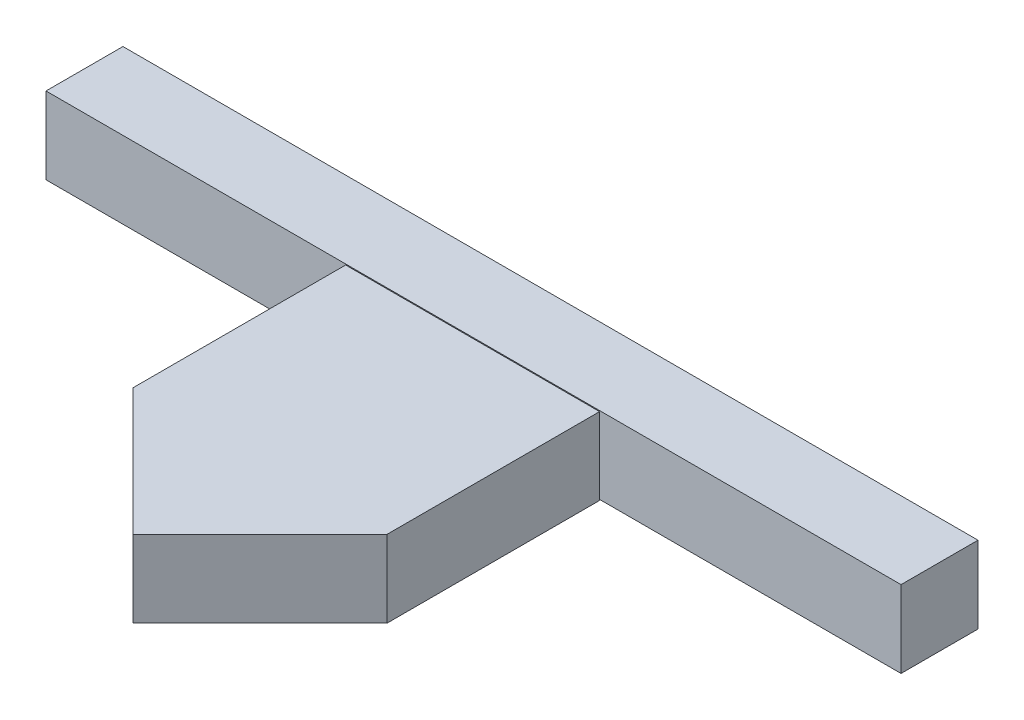
ISO-10303-21;
HEADER;
FILE_DESCRIPTION(('STEP AP214'),'2;1');
FILE_NAME('part.step','',(''),(''),'','','');
FILE_SCHEMA(('AUTOMOTIVE_DESIGN { 1 0 10303 214 1 1 1 1 }'));
ENDSEC;
DATA;
#1=APPLICATION_CONTEXT('core data for automotive mechanical design processes');
#2=APPLICATION_PROTOCOL_DEFINITION('international standard','automotive_design',2000,#1);
#3=PRODUCT_CONTEXT('',#1,'mechanical');
#4=PRODUCT('Part','Part','',(#3));
#5=PRODUCT_RELATED_PRODUCT_CATEGORY('part','',(#4));
#6=PRODUCT_DEFINITION_FORMATION('','',#4);
#7=PRODUCT_DEFINITION_CONTEXT('part definition',#1,'design');
#8=PRODUCT_DEFINITION('design','',#6,#7);
#9=PRODUCT_DEFINITION_SHAPE('','',#8);
#10=(LENGTH_UNIT() NAMED_UNIT(*) SI_UNIT(.MILLI.,.METRE.));
#11=(NAMED_UNIT(*) PLANE_ANGLE_UNIT() SI_UNIT($,.RADIAN.));
#12=(NAMED_UNIT(*) SI_UNIT($,.STERADIAN.) SOLID_ANGLE_UNIT());
#13=UNCERTAINTY_MEASURE_WITH_UNIT(LENGTH_MEASURE(1.E-05),#10,'distance_accuracy_value','');
#14=(GEOMETRIC_REPRESENTATION_CONTEXT(3) GLOBAL_UNCERTAINTY_ASSIGNED_CONTEXT((#13)) GLOBAL_UNIT_ASSIGNED_CONTEXT((#10,
#11,#12)) REPRESENTATION_CONTEXT('',''));
#15=CARTESIAN_POINT('',(0.,0.,0.));
#16=DIRECTION('',(0.,0.,1.));
#17=DIRECTION('',(1.,0.,0.));
#18=AXIS2_PLACEMENT_3D('',#15,#16,#17);
#19=CARTESIAN_POINT('',(50.0000000000002,9.,0.));
#20=DIRECTION('',(1.,0.,0.));
#21=DIRECTION('',(0.,0.,-1.));
#22=AXIS2_PLACEMENT_3D('',#19,#20,#21);
#23=PLANE('',#22);
#24=DIRECTION('',(0.,0.,1.));
#25=VECTOR('',#24,1.);
#26=CARTESIAN_POINT('',(50.0000000000002,0.,0.));
#27=LINE('',#26,#25);
#28=CARTESIAN_POINT('',(50.0000000000002,0.,-33.9572754688822));
#29=VERTEX_POINT('',#28);
#30=CARTESIAN_POINT('',(50.0000000000002,0.,-24.9572754688822));
#31=VERTEX_POINT('',#30);
#32=EDGE_CURVE('E118',#29,#31,#27,.T.);
#33=ORIENTED_EDGE('',*,*,#32,.F.);
#34=DIRECTION('',(0.,-1.,0.));
#35=VECTOR('',#34,1.);
#36=CARTESIAN_POINT('',(50.0000000000002,9.,-33.9572754688822));
#37=LINE('',#36,#35);
#38=CARTESIAN_POINT('',(50.0000000000002,9.,-33.9572754688822));
#39=VERTEX_POINT('',#38);
#40=EDGE_CURVE('E12',#39,#29,#37,.T.);
#41=ORIENTED_EDGE('',*,*,#40,.F.);
#42=DIRECTION('',(0.,0.,1.));
#43=VECTOR('',#42,1.);
#44=CARTESIAN_POINT('',(50.0000000000002,9.,0.));
#45=LINE('',#44,#43);
#46=CARTESIAN_POINT('',(50.0000000000002,9.,-24.9572754688822));
#47=VERTEX_POINT('',#46);
#48=EDGE_CURVE('E108',#39,#47,#45,.T.);
#49=ORIENTED_EDGE('',*,*,#48,.T.);
#50=DIRECTION('',(0.,-1.,0.));
#51=VECTOR('',#50,1.);
#52=CARTESIAN_POINT('',(50.0000000000002,9.,-24.9572754688822));
#53=LINE('',#52,#51);
#54=EDGE_CURVE('E87',#47,#31,#53,.T.);
#55=ORIENTED_EDGE('',*,*,#54,.T.);
#56=EDGE_LOOP('',(#33,#41,#49,#55));
#57=FACE_BOUND('',#56,.T.);
#58=ADVANCED_FACE('F48',(#57),#23,.T.);
#59=CARTESIAN_POINT('',(0.,9.,-33.9572754688822));
#60=DIRECTION('',(0.,0.,-1.));
#61=DIRECTION('',(-1.,0.,0.));
#62=AXIS2_PLACEMENT_3D('',#59,#60,#61);
#63=PLANE('',#62);
#64=DIRECTION('',(1.,0.,0.));
#65=VECTOR('',#64,1.);
#66=CARTESIAN_POINT('',(0.,0.,-33.9572754688822));
#67=LINE('',#66,#65);
#68=CARTESIAN_POINT('',(-49.9999999999998,0.,-33.9572754688822));
#69=VERTEX_POINT('',#68);
#70=EDGE_CURVE('E100',#69,#29,#67,.T.);
#71=ORIENTED_EDGE('',*,*,#70,.F.);
#72=DIRECTION('',(0.,-1.,0.));
#73=VECTOR('',#72,1.);
#74=CARTESIAN_POINT('',(-49.9999999999998,9.,-33.9572754688822));
#75=LINE('',#74,#73);
#76=CARTESIAN_POINT('',(-49.9999999999998,9.,-33.9572754688822));
#77=VERTEX_POINT('',#76);
#78=EDGE_CURVE('E57',#77,#69,#75,.T.);
#79=ORIENTED_EDGE('',*,*,#78,.F.);
#80=DIRECTION('',(1.,0.,0.));
#81=VECTOR('',#80,1.);
#82=CARTESIAN_POINT('',(0.,9.,-33.9572754688822));
#83=LINE('',#82,#81);
#84=EDGE_CURVE('E98',#77,#39,#83,.T.);
#85=ORIENTED_EDGE('',*,*,#84,.T.);
#86=ORIENTED_EDGE('',*,*,#40,.T.);
#87=EDGE_LOOP('',(#71,#79,#85,#86));
#88=FACE_BOUND('',#87,.T.);
#89=ADVANCED_FACE('F96',(#88),#63,.T.);
#90=CARTESIAN_POINT('',(-49.9999999999998,9.,0.));
#91=DIRECTION('',(1.,0.,0.));
#92=DIRECTION('',(0.,0.,-1.));
#93=AXIS2_PLACEMENT_3D('',#90,#91,#92);
#94=PLANE('',#93);
#95=DIRECTION('',(0.,0.,1.));
#96=VECTOR('',#95,1.);
#97=CARTESIAN_POINT('',(-49.9999999999998,0.,0.));
#98=LINE('',#97,#96);
#99=CARTESIAN_POINT('',(-49.9999999999998,0.,-24.9572754688822));
#100=VERTEX_POINT('',#99);
#101=EDGE_CURVE('E80',#69,#100,#98,.T.);
#102=ORIENTED_EDGE('',*,*,#101,.T.);
#103=DIRECTION('',(0.,-1.,0.));
#104=VECTOR('',#103,1.);
#105=CARTESIAN_POINT('',(-49.9999999999998,9.,-24.9572754688822));
#106=LINE('',#105,#104);
#107=CARTESIAN_POINT('',(-49.9999999999998,9.,-24.9572754688822));
#108=VERTEX_POINT('',#107);
#109=EDGE_CURVE('E102',#108,#100,#106,.T.);
#110=ORIENTED_EDGE('',*,*,#109,.F.);
#111=DIRECTION('',(0.,0.,1.));
#112=VECTOR('',#111,1.);
#113=CARTESIAN_POINT('',(-49.9999999999998,9.,0.));
#114=LINE('',#113,#112);
#115=EDGE_CURVE('E103',#77,#108,#114,.T.);
#116=ORIENTED_EDGE('',*,*,#115,.F.);
#117=ORIENTED_EDGE('',*,*,#78,.T.);
#118=EDGE_LOOP('',(#102,#110,#116,#117));
#119=FACE_BOUND('',#118,.T.);
#120=ADVANCED_FACE('F104',(#119),#94,.F.);
#121=CARTESIAN_POINT('',(0.,9.,-24.9572754688822));
#122=DIRECTION('',(0.,0.,-1.));
#123=DIRECTION('',(-1.,0.,0.));
#124=AXIS2_PLACEMENT_3D('',#121,#122,#123);
#125=PLANE('',#124);
#126=DIRECTION('',(1.,0.,0.));
#127=VECTOR('',#126,1.);
#128=CARTESIAN_POINT('',(0.,0.,-24.9572754688822));
#129=LINE('',#128,#127);
#130=EDGE_CURVE('E113',#100,#31,#129,.T.);
#131=ORIENTED_EDGE('',*,*,#130,.T.);
#132=ORIENTED_EDGE('',*,*,#54,.F.);
#133=DIRECTION('',(1.,0.,0.));
#134=VECTOR('',#133,1.);
#135=CARTESIAN_POINT('',(0.,9.,-24.9572754688822));
#136=LINE('',#135,#134);
#137=EDGE_CURVE('E65',#108,#47,#136,.T.);
#138=ORIENTED_EDGE('',*,*,#137,.F.);
#139=ORIENTED_EDGE('',*,*,#109,.T.);
#140=EDGE_LOOP('',(#131,#132,#138,#139));
#141=FACE_BOUND('',#140,.T.);
#142=ADVANCED_FACE('F132',(#141),#125,.F.);
#143=CARTESIAN_POINT('',(0.,9.,0.));
#144=DIRECTION('',(0.,1.,0.));
#145=DIRECTION('',(0.,0.,1.));
#146=AXIS2_PLACEMENT_3D('',#143,#144,#145);
#147=PLANE('',#146);
#148=ORIENTED_EDGE('',*,*,#48,.F.);
#149=ORIENTED_EDGE('',*,*,#84,.F.);
#150=ORIENTED_EDGE('',*,*,#115,.T.);
#151=ORIENTED_EDGE('',*,*,#137,.T.);
#152=EDGE_LOOP('',(#148,#149,#150,#151));
#153=FACE_BOUND('',#152,.T.);
#154=ADVANCED_FACE('F107',(#153),#147,.T.);
#155=CARTESIAN_POINT('',(0.,0.,0.));
#156=DIRECTION('',(0.,1.,0.));
#157=DIRECTION('',(0.,0.,1.));
#158=AXIS2_PLACEMENT_3D('',#155,#156,#157);
#159=PLANE('',#158);
#160=ORIENTED_EDGE('',*,*,#32,.T.);
#161=ORIENTED_EDGE('',*,*,#130,.F.);
#162=ORIENTED_EDGE('',*,*,#101,.F.);
#163=ORIENTED_EDGE('',*,*,#70,.T.);
#164=EDGE_LOOP('',(#160,#161,#162,#163));
#165=FACE_BOUND('',#164,.T.);
#166=ADVANCED_FACE('F134',(#165),#159,.F.);
#167=CLOSED_SHELL('',(#58,#89,#120,#142,#154,#166));
#168=MANIFOLD_SOLID_BREP('B2',#167);
#169=CARTESIAN_POINT('',(7.42462120245875,9.,7.42462120245875));
#170=DIRECTION('',(-0.707106781186547,0.,-0.707106781186547));
#171=DIRECTION('',(-0.707106781186548,0.,0.707106781186548));
#172=AXIS2_PLACEMENT_3D('',#169,#170,#171);
#173=PLANE('',#172);
#174=DIRECTION('',(0.707106781186548,0.,-0.707106781186548));
#175=VECTOR('',#174,1.);
#176=CARTESIAN_POINT('',(7.42462120245875,0.,7.42462120245875));
#177=LINE('',#176,#175);
#178=CARTESIAN_POINT('',(0.,0.,14.8492424049175));
#179=VERTEX_POINT('',#178);
#180=CARTESIAN_POINT('',(14.8492424049175,0.,0.));
#181=VERTEX_POINT('',#180);
#182=EDGE_CURVE('E275',#179,#181,#177,.T.);
#183=ORIENTED_EDGE('',*,*,#182,.T.);
#184=DIRECTION('',(0.,-1.,0.));
#185=VECTOR('',#184,1.);
#186=CARTESIAN_POINT('',(14.8492424049175,9.,0.));
#187=LINE('',#186,#185);
#188=CARTESIAN_POINT('',(14.8492424049175,9.,0.));
#189=VERTEX_POINT('',#188);
#190=EDGE_CURVE('E46',#189,#181,#187,.T.);
#191=ORIENTED_EDGE('',*,*,#190,.F.);
#192=DIRECTION('',(0.707106781186548,0.,-0.707106781186548));
#193=VECTOR('',#192,1.);
#194=CARTESIAN_POINT('',(7.42462120245875,9.,7.42462120245875));
#195=LINE('',#194,#193);
#196=CARTESIAN_POINT('',(0.,9.,14.8492424049175));
#197=VERTEX_POINT('',#196);
#198=EDGE_CURVE('E240',#197,#189,#195,.T.);
#199=ORIENTED_EDGE('',*,*,#198,.F.);
#200=DIRECTION('',(0.,-1.,0.));
#201=VECTOR('',#200,1.);
#202=CARTESIAN_POINT('',(0.,9.,14.8492424049175));
#203=LINE('',#202,#201);
#204=EDGE_CURVE('E212',#197,#179,#203,.T.);
#205=ORIENTED_EDGE('',*,*,#204,.T.);
#206=EDGE_LOOP('',(#183,#191,#199,#205));
#207=FACE_BOUND('',#206,.T.);
#208=ADVANCED_FACE('F195',(#207),#173,.F.);
#209=CARTESIAN_POINT('',(14.8492424049175,9.,0.));
#210=DIRECTION('',(1.,0.,0.));
#211=DIRECTION('',(0.,0.,-1.));
#212=AXIS2_PLACEMENT_3D('',#209,#210,#211);
#213=PLANE('',#212);
#214=DIRECTION('',(0.,0.,1.));
#215=VECTOR('',#214,1.);
#216=CARTESIAN_POINT('',(14.8492424049175,0.,0.));
#217=LINE('',#216,#215);
#218=CARTESIAN_POINT('',(14.8492424049175,0.,-24.8492424049175));
#219=VERTEX_POINT('',#218);
#220=EDGE_CURVE('E278',#219,#181,#217,.T.);
#221=ORIENTED_EDGE('',*,*,#220,.F.);
#222=DIRECTION('',(0.,-1.,0.));
#223=VECTOR('',#222,1.);
#224=CARTESIAN_POINT('',(14.8492424049175,9.,-24.8492424049175));
#225=LINE('',#224,#223);
#226=CARTESIAN_POINT('',(14.8492424049175,9.,-24.8492424049175));
#227=VERTEX_POINT('',#226);
#228=EDGE_CURVE('E204',#227,#219,#225,.T.);
#229=ORIENTED_EDGE('',*,*,#228,.F.);
#230=DIRECTION('',(0.,0.,1.));
#231=VECTOR('',#230,1.);
#232=CARTESIAN_POINT('',(14.8492424049175,9.,0.));
#233=LINE('',#232,#231);
#234=EDGE_CURVE('E263',#227,#189,#233,.T.);
#235=ORIENTED_EDGE('',*,*,#234,.T.);
#236=ORIENTED_EDGE('',*,*,#190,.T.);
#237=EDGE_LOOP('',(#221,#229,#235,#236));
#238=FACE_BOUND('',#237,.T.);
#239=ADVANCED_FACE('F297',(#238),#213,.T.);
#240=CARTESIAN_POINT('',(0.,9.,-24.8492424049175));
#241=DIRECTION('',(0.,0.,-1.));
#242=DIRECTION('',(-1.,0.,0.));
#243=AXIS2_PLACEMENT_3D('',#240,#241,#242);
#244=PLANE('',#243);
#245=DIRECTION('',(1.,0.,0.));
#246=VECTOR('',#245,1.);
#247=CARTESIAN_POINT('',(0.,0.,-24.8492424049175));
#248=LINE('',#247,#246);
#249=CARTESIAN_POINT('',(-14.8492424049175,0.,-24.8492424049175));
#250=VERTEX_POINT('',#249);
#251=EDGE_CURVE('E253',#250,#219,#248,.T.);
#252=ORIENTED_EDGE('',*,*,#251,.F.);
#253=DIRECTION('',(0.,-1.,0.));
#254=VECTOR('',#253,1.);
#255=CARTESIAN_POINT('',(-14.8492424049175,9.,-24.8492424049175));
#256=LINE('',#255,#254);
#257=CARTESIAN_POINT('',(-14.8492424049175,9.,-24.8492424049175));
#258=VERTEX_POINT('',#257);
#259=EDGE_CURVE('E248',#258,#250,#256,.T.);
#260=ORIENTED_EDGE('',*,*,#259,.F.);
#261=DIRECTION('',(1.,0.,0.));
#262=VECTOR('',#261,1.);
#263=CARTESIAN_POINT('',(0.,9.,-24.8492424049175));
#264=LINE('',#263,#262);
#265=EDGE_CURVE('E251',#258,#227,#264,.T.);
#266=ORIENTED_EDGE('',*,*,#265,.T.);
#267=ORIENTED_EDGE('',*,*,#228,.T.);
#268=EDGE_LOOP('',(#252,#260,#266,#267));
#269=FACE_BOUND('',#268,.T.);
#270=ADVANCED_FACE('F250',(#269),#244,.T.);
#271=CARTESIAN_POINT('',(-14.8492424049175,9.,0.));
#272=DIRECTION('',(-1.,0.,0.));
#273=DIRECTION('',(0.,0.,1.));
#274=AXIS2_PLACEMENT_3D('',#271,#272,#273);
#275=PLANE('',#274);
#276=DIRECTION('',(0.,0.,-1.));
#277=VECTOR('',#276,1.);
#278=CARTESIAN_POINT('',(-14.8492424049175,0.,0.));
#279=LINE('',#278,#277);
#280=CARTESIAN_POINT('',(-14.8492424049175,0.,0.));
#281=VERTEX_POINT('',#280);
#282=EDGE_CURVE('E284',#281,#250,#279,.T.);
#283=ORIENTED_EDGE('',*,*,#282,.F.);
#284=DIRECTION('',(0.,-1.,0.));
#285=VECTOR('',#284,1.);
#286=CARTESIAN_POINT('',(-14.8492424049175,9.,0.));
#287=LINE('',#286,#285);
#288=CARTESIAN_POINT('',(-14.8492424049175,9.,0.));
#289=VERTEX_POINT('',#288);
#290=EDGE_CURVE('E228',#289,#281,#287,.T.);
#291=ORIENTED_EDGE('',*,*,#290,.F.);
#292=DIRECTION('',(0.,0.,-1.));
#293=VECTOR('',#292,1.);
#294=CARTESIAN_POINT('',(-14.8492424049175,9.,0.));
#295=LINE('',#294,#293);
#296=EDGE_CURVE('E261',#289,#258,#295,.T.);
#297=ORIENTED_EDGE('',*,*,#296,.T.);
#298=ORIENTED_EDGE('',*,*,#259,.T.);
#299=EDGE_LOOP('',(#283,#291,#297,#298));
#300=FACE_BOUND('',#299,.T.);
#301=ADVANCED_FACE('F266',(#300),#275,.T.);
#302=CARTESIAN_POINT('',(-7.42462120245875,9.,7.42462120245875));
#303=DIRECTION('',(-0.707106781186547,0.,0.707106781186547));
#304=DIRECTION('',(0.707106781186548,0.,0.707106781186548));
#305=AXIS2_PLACEMENT_3D('',#302,#303,#304);
#306=PLANE('',#305);
#307=DIRECTION('',(-0.707106781186548,0.,-0.707106781186548));
#308=VECTOR('',#307,1.);
#309=CARTESIAN_POINT('',(-7.42462120245875,0.,7.42462120245875));
#310=LINE('',#309,#308);
#311=EDGE_CURVE('E287',#179,#281,#310,.T.);
#312=ORIENTED_EDGE('',*,*,#311,.F.);
#313=ORIENTED_EDGE('',*,*,#204,.F.);
#314=DIRECTION('',(-0.707106781186548,0.,-0.707106781186548));
#315=VECTOR('',#314,1.);
#316=CARTESIAN_POINT('',(-7.42462120245875,9.,7.42462120245875));
#317=LINE('',#316,#315);
#318=EDGE_CURVE('E268',#197,#289,#317,.T.);
#319=ORIENTED_EDGE('',*,*,#318,.T.);
#320=ORIENTED_EDGE('',*,*,#290,.T.);
#321=EDGE_LOOP('',(#312,#313,#319,#320));
#322=FACE_BOUND('',#321,.T.);
#323=ADVANCED_FACE('F300',(#322),#306,.T.);
#324=CARTESIAN_POINT('',(0.,9.,0.));
#325=DIRECTION('',(0.,1.,0.));
#326=DIRECTION('',(0.,0.,1.));
#327=AXIS2_PLACEMENT_3D('',#324,#325,#326);
#328=PLANE('',#327);
#329=ORIENTED_EDGE('',*,*,#198,.T.);
#330=ORIENTED_EDGE('',*,*,#234,.F.);
#331=ORIENTED_EDGE('',*,*,#265,.F.);
#332=ORIENTED_EDGE('',*,*,#296,.F.);
#333=ORIENTED_EDGE('',*,*,#318,.F.);
#334=EDGE_LOOP('',(#329,#330,#331,#332,#333));
#335=FACE_BOUND('',#334,.T.);
#336=ADVANCED_FACE('F260',(#335),#328,.T.);
#337=CARTESIAN_POINT('',(0.,0.,0.));
#338=DIRECTION('',(0.,1.,0.));
#339=DIRECTION('',(0.,0.,1.));
#340=AXIS2_PLACEMENT_3D('',#337,#338,#339);
#341=PLANE('',#340);
#342=ORIENTED_EDGE('',*,*,#182,.F.);
#343=ORIENTED_EDGE('',*,*,#311,.T.);
#344=ORIENTED_EDGE('',*,*,#282,.T.);
#345=ORIENTED_EDGE('',*,*,#251,.T.);
#346=ORIENTED_EDGE('',*,*,#220,.T.);
#347=EDGE_LOOP('',(#342,#343,#344,#345,#346));
#348=FACE_BOUND('',#347,.T.);
#349=ADVANCED_FACE('F299',(#348),#341,.F.);
#350=CLOSED_SHELL('',(#208,#239,#270,#301,#323,#336,#349));
#351=MANIFOLD_SOLID_BREP('B6',#350);
#352=ADVANCED_BREP_SHAPE_REPRESENTATION('',(#18,#168,#351),#14);
#353=SHAPE_DEFINITION_REPRESENTATION(#9,#352);
ENDSEC;
END-ISO-10303-21;
